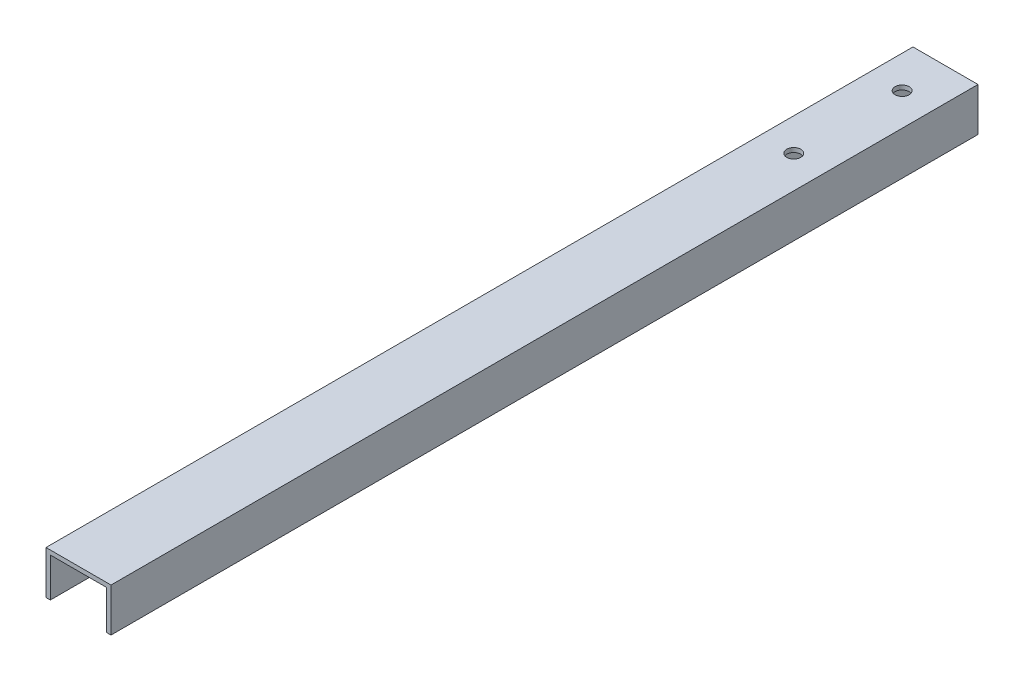
ISO-10303-21;
HEADER;
FILE_DESCRIPTION(('STEP AP214'),'2;1');
FILE_NAME('part.step','',(''),(''),'','','');
FILE_SCHEMA(('AUTOMOTIVE_DESIGN { 1 0 10303 214 1 1 1 1 }'));
ENDSEC;
DATA;
#1=APPLICATION_CONTEXT('core data for automotive mechanical design processes');
#2=APPLICATION_PROTOCOL_DEFINITION('international standard','automotive_design',2000,#1);
#3=PRODUCT_CONTEXT('',#1,'mechanical');
#4=PRODUCT('Part','Part','',(#3));
#5=PRODUCT_RELATED_PRODUCT_CATEGORY('part','',(#4));
#6=PRODUCT_DEFINITION_FORMATION('','',#4);
#7=PRODUCT_DEFINITION_CONTEXT('part definition',#1,'design');
#8=PRODUCT_DEFINITION('design','',#6,#7);
#9=PRODUCT_DEFINITION_SHAPE('','',#8);
#10=(LENGTH_UNIT() NAMED_UNIT(*) SI_UNIT(.MILLI.,.METRE.));
#11=(NAMED_UNIT(*) PLANE_ANGLE_UNIT() SI_UNIT($,.RADIAN.));
#12=(NAMED_UNIT(*) SI_UNIT($,.STERADIAN.) SOLID_ANGLE_UNIT());
#13=UNCERTAINTY_MEASURE_WITH_UNIT(LENGTH_MEASURE(1.E-05),#10,'distance_accuracy_value','');
#14=(GEOMETRIC_REPRESENTATION_CONTEXT(3) GLOBAL_UNCERTAINTY_ASSIGNED_CONTEXT((#13)) GLOBAL_UNIT_ASSIGNED_CONTEXT((#10,
#11,#12)) REPRESENTATION_CONTEXT('',''));
#15=CARTESIAN_POINT('',(0.,0.,0.));
#16=DIRECTION('',(0.,0.,1.));
#17=DIRECTION('',(1.,0.,0.));
#18=AXIS2_PLACEMENT_3D('',#15,#16,#17);
#19=CARTESIAN_POINT('',(0.,0.,400.));
#20=DIRECTION('',(0.,1.,0.));
#21=DIRECTION('',(0.,0.,1.));
#22=AXIS2_PLACEMENT_3D('',#19,#20,#21);
#23=PLANE('',#22);
#24=DIRECTION('',(1.,0.,0.));
#25=VECTOR('',#24,1.);
#26=CARTESIAN_POINT('',(0.,0.,0.));
#27=LINE('',#26,#25);
#28=CARTESIAN_POINT('',(0.,0.,0.));
#29=VERTEX_POINT('',#28);
#30=CARTESIAN_POINT('',(2.,0.,0.));
#31=VERTEX_POINT('',#30);
#32=EDGE_CURVE('E135',#29,#31,#27,.T.);
#33=ORIENTED_EDGE('',*,*,#32,.T.);
#34=DIRECTION('',(0.,0.,-1.));
#35=VECTOR('',#34,1.);
#36=CARTESIAN_POINT('',(2.,0.,400.));
#37=LINE('',#36,#35);
#38=CARTESIAN_POINT('',(2.,0.,400.));
#39=VERTEX_POINT('',#38);
#40=EDGE_CURVE('E11',#39,#31,#37,.T.);
#41=ORIENTED_EDGE('',*,*,#40,.F.);
#42=DIRECTION('',(1.,0.,0.));
#43=VECTOR('',#42,1.);
#44=CARTESIAN_POINT('',(0.,0.,400.));
#45=LINE('',#44,#43);
#46=CARTESIAN_POINT('',(0.,0.,400.));
#47=VERTEX_POINT('',#46);
#48=EDGE_CURVE('E154',#47,#39,#45,.T.);
#49=ORIENTED_EDGE('',*,*,#48,.F.);
#50=DIRECTION('',(0.,0.,-1.));
#51=VECTOR('',#50,1.);
#52=CARTESIAN_POINT('',(0.,0.,400.));
#53=LINE('',#52,#51);
#54=EDGE_CURVE('E53',#47,#29,#53,.T.);
#55=ORIENTED_EDGE('',*,*,#54,.T.);
#56=EDGE_LOOP('',(#33,#41,#49,#55));
#57=FACE_BOUND('',#56,.T.);
#58=ADVANCED_FACE('F37',(#57),#23,.F.);
#59=CARTESIAN_POINT('',(2.,0.,400.));
#60=DIRECTION('',(-1.,0.,0.));
#61=DIRECTION('',(0.,0.,1.));
#62=AXIS2_PLACEMENT_3D('',#59,#60,#61);
#63=PLANE('',#62);
#64=DIRECTION('',(0.,1.,0.));
#65=VECTOR('',#64,1.);
#66=CARTESIAN_POINT('',(2.,0.,0.));
#67=LINE('',#66,#65);
#68=CARTESIAN_POINT('',(2.,18.,0.));
#69=VERTEX_POINT('',#68);
#70=EDGE_CURVE('E137',#31,#69,#67,.T.);
#71=ORIENTED_EDGE('',*,*,#70,.T.);
#72=DIRECTION('',(0.,0.,-1.));
#73=VECTOR('',#72,1.);
#74=CARTESIAN_POINT('',(2.,18.,400.));
#75=LINE('',#74,#73);
#76=CARTESIAN_POINT('',(2.,18.,400.));
#77=VERTEX_POINT('',#76);
#78=EDGE_CURVE('E45',#77,#69,#75,.T.);
#79=ORIENTED_EDGE('',*,*,#78,.F.);
#80=DIRECTION('',(0.,1.,0.));
#81=VECTOR('',#80,1.);
#82=CARTESIAN_POINT('',(2.,0.,400.));
#83=LINE('',#82,#81);
#84=EDGE_CURVE('E91',#39,#77,#83,.T.);
#85=ORIENTED_EDGE('',*,*,#84,.F.);
#86=ORIENTED_EDGE('',*,*,#40,.T.);
#87=EDGE_LOOP('',(#71,#79,#85,#86));
#88=FACE_BOUND('',#87,.T.);
#89=ADVANCED_FACE('F209',(#88),#63,.F.);
#90=CARTESIAN_POINT('',(2.,18.,400.));
#91=DIRECTION('',(0.,1.,0.));
#92=DIRECTION('',(0.,0.,1.));
#93=AXIS2_PLACEMENT_3D('',#90,#91,#92);
#94=PLANE('',#93);
#95=CARTESIAN_POINT('',(15.,18.,70.));
#96=DIRECTION('',(0.,1.,0.));
#97=DIRECTION('',(0.,0.,1.));
#98=AXIS2_PLACEMENT_3D('',#95,#96,#97);
#99=CIRCLE('',#98,3.25);
#100=CARTESIAN_POINT('',(15.,18.,73.25));
#101=VERTEX_POINT('',#100);
#102=EDGE_CURVE('E138',#101,#101,#99,.T.);
#103=ORIENTED_EDGE('',*,*,#102,.T.);
#104=EDGE_LOOP('',(#103));
#105=FACE_BOUND('',#104,.T.);
#106=CARTESIAN_POINT('',(15.,18.,20.));
#107=DIRECTION('',(0.,1.,0.));
#108=DIRECTION('',(0.,0.,1.));
#109=AXIS2_PLACEMENT_3D('',#106,#107,#108);
#110=CIRCLE('',#109,3.25);
#111=CARTESIAN_POINT('',(15.,18.,23.25));
#112=VERTEX_POINT('',#111);
#113=EDGE_CURVE('E183',#112,#112,#110,.T.);
#114=ORIENTED_EDGE('',*,*,#113,.T.);
#115=EDGE_LOOP('',(#114));
#116=FACE_BOUND('',#115,.T.);
#117=DIRECTION('',(1.,0.,0.));
#118=VECTOR('',#117,1.);
#119=CARTESIAN_POINT('',(2.,18.,0.));
#120=LINE('',#119,#118);
#121=CARTESIAN_POINT('',(28.,18.,0.));
#122=VERTEX_POINT('',#121);
#123=EDGE_CURVE('E140',#69,#122,#120,.T.);
#124=ORIENTED_EDGE('',*,*,#123,.T.);
#125=DIRECTION('',(0.,0.,-1.));
#126=VECTOR('',#125,1.);
#127=CARTESIAN_POINT('',(28.,18.,400.));
#128=LINE('',#127,#126);
#129=CARTESIAN_POINT('',(28.,18.,400.));
#130=VERTEX_POINT('',#129);
#131=EDGE_CURVE('E160',#130,#122,#128,.T.);
#132=ORIENTED_EDGE('',*,*,#131,.F.);
#133=DIRECTION('',(1.,0.,0.));
#134=VECTOR('',#133,1.);
#135=CARTESIAN_POINT('',(2.,18.,400.));
#136=LINE('',#135,#134);
#137=EDGE_CURVE('E167',#77,#130,#136,.T.);
#138=ORIENTED_EDGE('',*,*,#137,.F.);
#139=ORIENTED_EDGE('',*,*,#78,.T.);
#140=EDGE_LOOP('',(#124,#132,#138,#139));
#141=FACE_BOUND('',#140,.T.);
#142=ADVANCED_FACE('F165',(#105,#116,#141),#94,.F.);
#143=CARTESIAN_POINT('',(28.,0.,400.));
#144=DIRECTION('',(-1.,0.,0.));
#145=DIRECTION('',(0.,0.,1.));
#146=AXIS2_PLACEMENT_3D('',#143,#144,#145);
#147=PLANE('',#146);
#148=DIRECTION('',(0.,1.,0.));
#149=VECTOR('',#148,1.);
#150=CARTESIAN_POINT('',(28.,0.,0.));
#151=LINE('',#150,#149);
#152=CARTESIAN_POINT('',(28.,0.,0.));
#153=VERTEX_POINT('',#152);
#154=EDGE_CURVE('E143',#153,#122,#151,.T.);
#155=ORIENTED_EDGE('',*,*,#154,.F.);
#156=DIRECTION('',(0.,0.,-1.));
#157=VECTOR('',#156,1.);
#158=CARTESIAN_POINT('',(28.,0.,400.));
#159=LINE('',#158,#157);
#160=CARTESIAN_POINT('',(28.,0.,400.));
#161=VERTEX_POINT('',#160);
#162=EDGE_CURVE('E158',#161,#153,#159,.T.);
#163=ORIENTED_EDGE('',*,*,#162,.F.);
#164=DIRECTION('',(0.,1.,0.));
#165=VECTOR('',#164,1.);
#166=CARTESIAN_POINT('',(28.,0.,400.));
#167=LINE('',#166,#165);
#168=EDGE_CURVE('E175',#161,#130,#167,.T.);
#169=ORIENTED_EDGE('',*,*,#168,.T.);
#170=ORIENTED_EDGE('',*,*,#131,.T.);
#171=EDGE_LOOP('',(#155,#163,#169,#170));
#172=FACE_BOUND('',#171,.T.);
#173=ADVANCED_FACE('F173',(#172),#147,.T.);
#174=CARTESIAN_POINT('',(28.,0.,400.));
#175=DIRECTION('',(0.,1.,0.));
#176=DIRECTION('',(0.,0.,1.));
#177=AXIS2_PLACEMENT_3D('',#174,#175,#176);
#178=PLANE('',#177);
#179=DIRECTION('',(1.,0.,0.));
#180=VECTOR('',#179,1.);
#181=CARTESIAN_POINT('',(28.,0.,0.));
#182=LINE('',#181,#180);
#183=CARTESIAN_POINT('',(30.,0.,0.));
#184=VERTEX_POINT('',#183);
#185=EDGE_CURVE('E146',#153,#184,#182,.T.);
#186=ORIENTED_EDGE('',*,*,#185,.T.);
#187=DIRECTION('',(0.,0.,-1.));
#188=VECTOR('',#187,1.);
#189=CARTESIAN_POINT('',(30.,0.,400.));
#190=LINE('',#189,#188);
#191=CARTESIAN_POINT('',(30.,0.,400.));
#192=VERTEX_POINT('',#191);
#193=EDGE_CURVE('E127',#192,#184,#190,.T.);
#194=ORIENTED_EDGE('',*,*,#193,.F.);
#195=DIRECTION('',(1.,0.,0.));
#196=VECTOR('',#195,1.);
#197=CARTESIAN_POINT('',(28.,0.,400.));
#198=LINE('',#197,#196);
#199=EDGE_CURVE('E115',#161,#192,#198,.T.);
#200=ORIENTED_EDGE('',*,*,#199,.F.);
#201=ORIENTED_EDGE('',*,*,#162,.T.);
#202=EDGE_LOOP('',(#186,#194,#200,#201));
#203=FACE_BOUND('',#202,.T.);
#204=ADVANCED_FACE('F216',(#203),#178,.F.);
#205=CARTESIAN_POINT('',(30.,0.,400.));
#206=DIRECTION('',(-1.,0.,0.));
#207=DIRECTION('',(0.,0.,1.));
#208=AXIS2_PLACEMENT_3D('',#205,#206,#207);
#209=PLANE('',#208);
#210=DIRECTION('',(0.,1.,0.));
#211=VECTOR('',#210,1.);
#212=CARTESIAN_POINT('',(30.,0.,0.));
#213=LINE('',#212,#211);
#214=CARTESIAN_POINT('',(30.,20.,0.));
#215=VERTEX_POINT('',#214);
#216=EDGE_CURVE('E124',#184,#215,#213,.T.);
#217=ORIENTED_EDGE('',*,*,#216,.T.);
#218=DIRECTION('',(0.,0.,-1.));
#219=VECTOR('',#218,1.);
#220=CARTESIAN_POINT('',(30.,20.,400.));
#221=LINE('',#220,#219);
#222=CARTESIAN_POINT('',(30.,20.,400.));
#223=VERTEX_POINT('',#222);
#224=EDGE_CURVE('E121',#223,#215,#221,.T.);
#225=ORIENTED_EDGE('',*,*,#224,.F.);
#226=DIRECTION('',(0.,1.,0.));
#227=VECTOR('',#226,1.);
#228=CARTESIAN_POINT('',(30.,0.,400.));
#229=LINE('',#228,#227);
#230=EDGE_CURVE('E107',#192,#223,#229,.T.);
#231=ORIENTED_EDGE('',*,*,#230,.F.);
#232=ORIENTED_EDGE('',*,*,#193,.T.);
#233=EDGE_LOOP('',(#217,#225,#231,#232));
#234=FACE_BOUND('',#233,.T.);
#235=ADVANCED_FACE('F122',(#234),#209,.F.);
#236=CARTESIAN_POINT('',(0.,20.,400.));
#237=DIRECTION('',(0.,1.,0.));
#238=DIRECTION('',(0.,0.,1.));
#239=AXIS2_PLACEMENT_3D('',#236,#237,#238);
#240=PLANE('',#239);
#241=CARTESIAN_POINT('',(15.,20.,70.));
#242=DIRECTION('',(0.,1.,0.));
#243=DIRECTION('',(0.,0.,1.));
#244=AXIS2_PLACEMENT_3D('',#241,#242,#243);
#245=CIRCLE('',#244,3.25);
#246=CARTESIAN_POINT('',(15.,20.,73.25));
#247=VERTEX_POINT('',#246);
#248=EDGE_CURVE('E186',#247,#247,#245,.T.);
#249=ORIENTED_EDGE('',*,*,#248,.F.);
#250=EDGE_LOOP('',(#249));
#251=FACE_BOUND('',#250,.T.);
#252=CARTESIAN_POINT('',(15.,20.,20.));
#253=DIRECTION('',(0.,1.,0.));
#254=DIRECTION('',(0.,0.,1.));
#255=AXIS2_PLACEMENT_3D('',#252,#253,#254);
#256=CIRCLE('',#255,3.25);
#257=CARTESIAN_POINT('',(15.,20.,23.25));
#258=VERTEX_POINT('',#257);
#259=EDGE_CURVE('E187',#258,#258,#256,.T.);
#260=ORIENTED_EDGE('',*,*,#259,.F.);
#261=EDGE_LOOP('',(#260));
#262=FACE_BOUND('',#261,.T.);
#263=DIRECTION('',(1.,0.,0.));
#264=VECTOR('',#263,1.);
#265=CARTESIAN_POINT('',(0.,20.,0.));
#266=LINE('',#265,#264);
#267=CARTESIAN_POINT('',(0.,20.,0.));
#268=VERTEX_POINT('',#267);
#269=EDGE_CURVE('E149',#268,#215,#266,.T.);
#270=ORIENTED_EDGE('',*,*,#269,.F.);
#271=DIRECTION('',(0.,0.,-1.));
#272=VECTOR('',#271,1.);
#273=CARTESIAN_POINT('',(0.,20.,400.));
#274=LINE('',#273,#272);
#275=CARTESIAN_POINT('',(0.,20.,400.));
#276=VERTEX_POINT('',#275);
#277=EDGE_CURVE('E79',#276,#268,#274,.T.);
#278=ORIENTED_EDGE('',*,*,#277,.F.);
#279=DIRECTION('',(1.,0.,0.));
#280=VECTOR('',#279,1.);
#281=CARTESIAN_POINT('',(0.,20.,400.));
#282=LINE('',#281,#280);
#283=EDGE_CURVE('E112',#276,#223,#282,.T.);
#284=ORIENTED_EDGE('',*,*,#283,.T.);
#285=ORIENTED_EDGE('',*,*,#224,.T.);
#286=EDGE_LOOP('',(#270,#278,#284,#285));
#287=FACE_BOUND('',#286,.T.);
#288=ADVANCED_FACE('F129',(#251,#262,#287),#240,.T.);
#289=CARTESIAN_POINT('',(0.,0.,400.));
#290=DIRECTION('',(-1.,0.,0.));
#291=DIRECTION('',(0.,0.,1.));
#292=AXIS2_PLACEMENT_3D('',#289,#290,#291);
#293=PLANE('',#292);
#294=DIRECTION('',(0.,1.,0.));
#295=VECTOR('',#294,1.);
#296=CARTESIAN_POINT('',(0.,0.,0.));
#297=LINE('',#296,#295);
#298=EDGE_CURVE('E151',#29,#268,#297,.T.);
#299=ORIENTED_EDGE('',*,*,#298,.F.);
#300=ORIENTED_EDGE('',*,*,#54,.F.);
#301=DIRECTION('',(0.,1.,0.));
#302=VECTOR('',#301,1.);
#303=CARTESIAN_POINT('',(0.,0.,400.));
#304=LINE('',#303,#302);
#305=EDGE_CURVE('E130',#47,#276,#304,.T.);
#306=ORIENTED_EDGE('',*,*,#305,.T.);
#307=ORIENTED_EDGE('',*,*,#277,.T.);
#308=EDGE_LOOP('',(#299,#300,#306,#307));
#309=FACE_BOUND('',#308,.T.);
#310=ADVANCED_FACE('F198',(#309),#293,.T.);
#311=CARTESIAN_POINT('',(0.,0.,400.));
#312=DIRECTION('',(0.,0.,1.));
#313=DIRECTION('',(1.,0.,0.));
#314=AXIS2_PLACEMENT_3D('',#311,#312,#313);
#315=PLANE('',#314);
#316=ORIENTED_EDGE('',*,*,#48,.T.);
#317=ORIENTED_EDGE('',*,*,#84,.T.);
#318=ORIENTED_EDGE('',*,*,#137,.T.);
#319=ORIENTED_EDGE('',*,*,#168,.F.);
#320=ORIENTED_EDGE('',*,*,#199,.T.);
#321=ORIENTED_EDGE('',*,*,#230,.T.);
#322=ORIENTED_EDGE('',*,*,#283,.F.);
#323=ORIENTED_EDGE('',*,*,#305,.F.);
#324=EDGE_LOOP('',(#316,#317,#318,#319,#320,#321,#322,#323));
#325=FACE_BOUND('',#324,.T.);
#326=ADVANCED_FACE('F109',(#325),#315,.T.);
#327=CARTESIAN_POINT('',(0.,0.,0.));
#328=DIRECTION('',(0.,0.,1.));
#329=DIRECTION('',(1.,0.,0.));
#330=AXIS2_PLACEMENT_3D('',#327,#328,#329);
#331=PLANE('',#330);
#332=ORIENTED_EDGE('',*,*,#32,.F.);
#333=ORIENTED_EDGE('',*,*,#298,.T.);
#334=ORIENTED_EDGE('',*,*,#269,.T.);
#335=ORIENTED_EDGE('',*,*,#216,.F.);
#336=ORIENTED_EDGE('',*,*,#185,.F.);
#337=ORIENTED_EDGE('',*,*,#154,.T.);
#338=ORIENTED_EDGE('',*,*,#123,.F.);
#339=ORIENTED_EDGE('',*,*,#70,.F.);
#340=EDGE_LOOP('',(#332,#333,#334,#335,#336,#337,#338,#339));
#341=FACE_BOUND('',#340,.T.);
#342=ADVANCED_FACE('F169',(#341),#331,.F.);
#343=CARTESIAN_POINT('',(15.,-280.,20.));
#344=DIRECTION('',(0.,1.,0.));
#345=DIRECTION('',(0.,0.,1.));
#346=AXIS2_PLACEMENT_3D('',#343,#344,#345);
#347=CYLINDRICAL_SURFACE('',#346,3.25);
#348=ORIENTED_EDGE('',*,*,#259,.T.);
#349=EDGE_LOOP('',(#348));
#350=FACE_BOUND('',#349,.T.);
#351=ORIENTED_EDGE('',*,*,#113,.F.);
#352=EDGE_LOOP('',(#351));
#353=FACE_BOUND('',#352,.T.);
#354=ADVANCED_FACE('F202',(#350,#353),#347,.F.);
#355=CARTESIAN_POINT('',(15.,-280.,70.));
#356=DIRECTION('',(0.,1.,0.));
#357=DIRECTION('',(0.,0.,1.));
#358=AXIS2_PLACEMENT_3D('',#355,#356,#357);
#359=CYLINDRICAL_SURFACE('',#358,3.25);
#360=ORIENTED_EDGE('',*,*,#248,.T.);
#361=EDGE_LOOP('',(#360));
#362=FACE_BOUND('',#361,.T.);
#363=ORIENTED_EDGE('',*,*,#102,.F.);
#364=EDGE_LOOP('',(#363));
#365=FACE_BOUND('',#364,.T.);
#366=ADVANCED_FACE('F193',(#362,#365),#359,.F.);
#367=CLOSED_SHELL('',(#58,#89,#142,#173,#204,#235,#288,#310,#326,#342,#354,#366));
#368=MANIFOLD_SOLID_BREP('B2',#367);
#369=ADVANCED_BREP_SHAPE_REPRESENTATION('',(#18,#368),#14);
#370=SHAPE_DEFINITION_REPRESENTATION(#9,#369);
ENDSEC;
END-ISO-10303-21;
